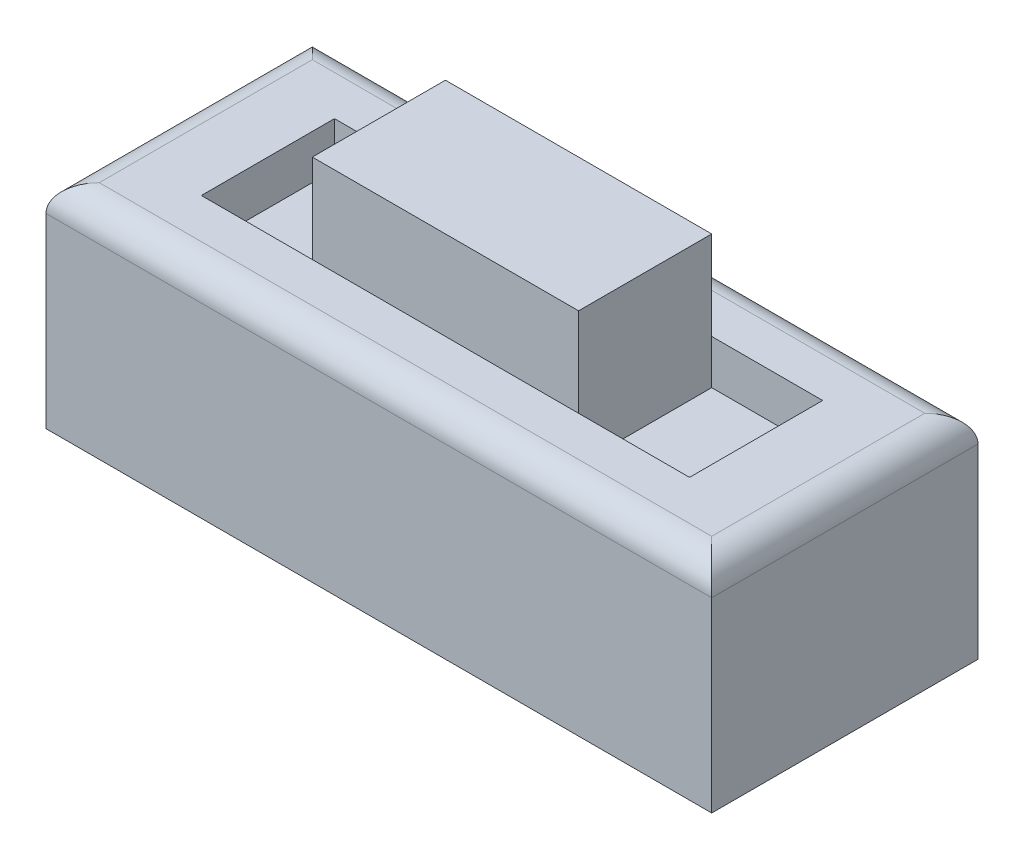
ISO-10303-21;
HEADER;
FILE_DESCRIPTION(('STEP AP214'),'2;1');
FILE_NAME('part.step','',(''),(''),'','','');
FILE_SCHEMA(('AUTOMOTIVE_DESIGN { 1 0 10303 214 1 1 1 1 }'));
ENDSEC;
DATA;
#1=APPLICATION_CONTEXT('core data for automotive mechanical design processes');
#2=APPLICATION_PROTOCOL_DEFINITION('international standard','automotive_design',2000,#1);
#3=PRODUCT_CONTEXT('',#1,'mechanical');
#4=PRODUCT('Part','Part','',(#3));
#5=PRODUCT_RELATED_PRODUCT_CATEGORY('part','',(#4));
#6=PRODUCT_DEFINITION_FORMATION('','',#4);
#7=PRODUCT_DEFINITION_CONTEXT('part definition',#1,'design');
#8=PRODUCT_DEFINITION('design','',#6,#7);
#9=PRODUCT_DEFINITION_SHAPE('','',#8);
#10=(LENGTH_UNIT() NAMED_UNIT(*) SI_UNIT(.MILLI.,.METRE.));
#11=(NAMED_UNIT(*) PLANE_ANGLE_UNIT() SI_UNIT($,.RADIAN.));
#12=(NAMED_UNIT(*) SI_UNIT($,.STERADIAN.) SOLID_ANGLE_UNIT());
#13=UNCERTAINTY_MEASURE_WITH_UNIT(LENGTH_MEASURE(1.E-05),#10,'distance_accuracy_value','');
#14=(GEOMETRIC_REPRESENTATION_CONTEXT(3) GLOBAL_UNCERTAINTY_ASSIGNED_CONTEXT((#13)) GLOBAL_UNIT_ASSIGNED_CONTEXT((#10,
#11,#12)) REPRESENTATION_CONTEXT('',''));
#15=CARTESIAN_POINT('',(0.,0.,0.));
#16=DIRECTION('',(0.,0.,1.));
#17=DIRECTION('',(1.,0.,0.));
#18=AXIS2_PLACEMENT_3D('',#15,#16,#17);
#19=CARTESIAN_POINT('',(-4.18968524629806,2.4,-2.6663961038961));
#20=DIRECTION('',(1.,0.,0.));
#21=DIRECTION('',(0.,0.,-1.));
#22=AXIS2_PLACEMENT_3D('',#19,#20,#21);
#23=PLANE('',#22);
#24=DIRECTION('',(0.,-1.,0.));
#25=VECTOR('',#24,1.);
#26=CARTESIAN_POINT('',(-4.18968524629806,2.4,0.333603896103896));
#27=LINE('',#26,#25);
#28=CARTESIAN_POINT('',(-4.18968524629806,2.1,0.333603896103896));
#29=VERTEX_POINT('',#28);
#30=CARTESIAN_POINT('',(-4.18968524629806,0.,0.333603896103896));
#31=VERTEX_POINT('',#30);
#32=EDGE_CURVE('E514',#29,#31,#27,.T.);
#33=ORIENTED_EDGE('',*,*,#32,.F.);
#34=DIRECTION('',(0.,0.,1.));
#35=VECTOR('',#34,1.);
#36=CARTESIAN_POINT('',(-4.18968524629806,2.1,-2.6663961038961));
#37=LINE('',#36,#35);
#38=CARTESIAN_POINT('',(-4.18968524629806,2.1,-2.6663961038961));
#39=VERTEX_POINT('',#38);
#40=EDGE_CURVE('E530',#29,#39,#37,.F.);
#41=ORIENTED_EDGE('',*,*,#40,.T.);
#42=DIRECTION('',(0.,-1.,0.));
#43=VECTOR('',#42,1.);
#44=CARTESIAN_POINT('',(-4.18968524629806,2.4,-2.6663961038961));
#45=LINE('',#44,#43);
#46=CARTESIAN_POINT('',(-4.18968524629806,0.,-2.6663961038961));
#47=VERTEX_POINT('',#46);
#48=EDGE_CURVE('E505',#39,#47,#45,.T.);
#49=ORIENTED_EDGE('',*,*,#48,.T.);
#50=DIRECTION('',(0.,0.,1.));
#51=VECTOR('',#50,1.);
#52=CARTESIAN_POINT('',(-4.18968524629806,0.,-2.6663961038961));
#53=LINE('',#52,#51);
#54=EDGE_CURVE('E489',#47,#31,#53,.T.);
#55=ORIENTED_EDGE('',*,*,#54,.T.);
#56=EDGE_LOOP('',(#33,#41,#49,#55));
#57=FACE_BOUND('',#56,.T.);
#58=ADVANCED_FACE('F43',(#57),#23,.F.);
#59=CARTESIAN_POINT('',(-4.18968524629806,2.4,0.333603896103896));
#60=DIRECTION('',(0.,0.,-1.));
#61=DIRECTION('',(-1.,0.,0.));
#62=AXIS2_PLACEMENT_3D('',#59,#60,#61);
#63=PLANE('',#62);
#64=DIRECTION('',(0.,-1.,0.));
#65=VECTOR('',#64,1.);
#66=CARTESIAN_POINT('',(3.31031475370194,2.4,0.333603896103896));
#67=LINE('',#66,#65);
#68=CARTESIAN_POINT('',(3.31031475370194,2.1,0.333603896103896));
#69=VERTEX_POINT('',#68);
#70=CARTESIAN_POINT('',(3.31031475370194,0.,0.333603896103896));
#71=VERTEX_POINT('',#70);
#72=EDGE_CURVE('E511',#69,#71,#67,.T.);
#73=ORIENTED_EDGE('',*,*,#72,.F.);
#74=DIRECTION('',(1.,0.,0.));
#75=VECTOR('',#74,1.);
#76=CARTESIAN_POINT('',(-4.18968524629806,2.1,0.333603896103896));
#77=LINE('',#76,#75);
#78=EDGE_CURVE('E11',#69,#29,#77,.F.);
#79=ORIENTED_EDGE('',*,*,#78,.T.);
#80=ORIENTED_EDGE('',*,*,#32,.T.);
#81=DIRECTION('',(1.,0.,0.));
#82=VECTOR('',#81,1.);
#83=CARTESIAN_POINT('',(-4.18968524629806,0.,0.333603896103896));
#84=LINE('',#83,#82);
#85=EDGE_CURVE('E493',#31,#71,#84,.T.);
#86=ORIENTED_EDGE('',*,*,#85,.T.);
#87=EDGE_LOOP('',(#73,#79,#80,#86));
#88=FACE_BOUND('',#87,.T.);
#89=ADVANCED_FACE('F563',(#88),#63,.F.);
#90=CARTESIAN_POINT('',(3.31031475370194,2.4,-2.6663961038961));
#91=DIRECTION('',(-1.,0.,0.));
#92=DIRECTION('',(0.,0.,1.));
#93=AXIS2_PLACEMENT_3D('',#90,#91,#92);
#94=PLANE('',#93);
#95=DIRECTION('',(0.,-1.,0.));
#96=VECTOR('',#95,1.);
#97=CARTESIAN_POINT('',(3.31031475370194,2.4,-2.6663961038961));
#98=LINE('',#97,#96);
#99=CARTESIAN_POINT('',(3.31031475370194,2.1,-2.6663961038961));
#100=VERTEX_POINT('',#99);
#101=CARTESIAN_POINT('',(3.31031475370194,0.,-2.6663961038961));
#102=VERTEX_POINT('',#101);
#103=EDGE_CURVE('E508',#100,#102,#98,.T.);
#104=ORIENTED_EDGE('',*,*,#103,.F.);
#105=DIRECTION('',(0.,0.,-1.));
#106=VECTOR('',#105,1.);
#107=CARTESIAN_POINT('',(3.31031475370194,2.1,0.333603896103896));
#108=LINE('',#107,#106);
#109=EDGE_CURVE('E53',#100,#69,#108,.F.);
#110=ORIENTED_EDGE('',*,*,#109,.T.);
#111=ORIENTED_EDGE('',*,*,#72,.T.);
#112=DIRECTION('',(0.,0.,-1.));
#113=VECTOR('',#112,1.);
#114=CARTESIAN_POINT('',(3.31031475370194,0.,-2.6663961038961));
#115=LINE('',#114,#113);
#116=EDGE_CURVE('E497',#71,#102,#115,.T.);
#117=ORIENTED_EDGE('',*,*,#116,.T.);
#118=EDGE_LOOP('',(#104,#110,#111,#117));
#119=FACE_BOUND('',#118,.T.);
#120=ADVANCED_FACE('F633',(#119),#94,.F.);
#121=CARTESIAN_POINT('',(-4.18968524629806,2.4,-2.6663961038961));
#122=DIRECTION('',(0.,0.,1.));
#123=DIRECTION('',(1.,0.,0.));
#124=AXIS2_PLACEMENT_3D('',#121,#122,#123);
#125=PLANE('',#124);
#126=ORIENTED_EDGE('',*,*,#48,.F.);
#127=DIRECTION('',(-1.,0.,0.));
#128=VECTOR('',#127,1.);
#129=CARTESIAN_POINT('',(3.31031475370194,2.1,-2.6663961038961));
#130=LINE('',#129,#128);
#131=EDGE_CURVE('E68',#39,#100,#130,.F.);
#132=ORIENTED_EDGE('',*,*,#131,.T.);
#133=ORIENTED_EDGE('',*,*,#103,.T.);
#134=DIRECTION('',(-1.,0.,0.));
#135=VECTOR('',#134,1.);
#136=CARTESIAN_POINT('',(-4.18968524629806,0.,-2.6663961038961));
#137=LINE('',#136,#135);
#138=EDGE_CURVE('E501',#102,#47,#137,.T.);
#139=ORIENTED_EDGE('',*,*,#138,.T.);
#140=EDGE_LOOP('',(#126,#132,#133,#139));
#141=FACE_BOUND('',#140,.T.);
#142=ADVANCED_FACE('F576',(#141),#125,.F.);
#143=CARTESIAN_POINT('',(0.,2.4,0.));
#144=DIRECTION('',(0.,1.,0.));
#145=DIRECTION('',(0.,0.,1.));
#146=AXIS2_PLACEMENT_3D('',#143,#144,#145);
#147=PLANE('',#146);
#148=DIRECTION('',(-1.,0.,0.));
#149=VECTOR('',#148,1.);
#150=CARTESIAN_POINT('',(-4.18968524629806,2.4,-2.3663961038961));
#151=LINE('',#150,#149);
#152=CARTESIAN_POINT('',(3.01031475370194,2.4,-2.3663961038961));
#153=VERTEX_POINT('',#152);
#154=CARTESIAN_POINT('',(-3.88968524629806,2.4,-2.3663961038961));
#155=VERTEX_POINT('',#154);
#156=EDGE_CURVE('E523',#153,#155,#151,.T.);
#157=ORIENTED_EDGE('',*,*,#156,.T.);
#158=DIRECTION('',(0.,0.,1.));
#159=VECTOR('',#158,1.);
#160=CARTESIAN_POINT('',(-3.88968524629806,2.4,0.333603896103897));
#161=LINE('',#160,#159);
#162=CARTESIAN_POINT('',(-3.88968524629806,2.4,0.0336038961038964));
#163=VERTEX_POINT('',#162);
#164=EDGE_CURVE('E526',#155,#163,#161,.T.);
#165=ORIENTED_EDGE('',*,*,#164,.T.);
#166=DIRECTION('',(1.,0.,0.));
#167=VECTOR('',#166,1.);
#168=CARTESIAN_POINT('',(3.31031475370194,2.4,0.0336038961038964));
#169=LINE('',#168,#167);
#170=CARTESIAN_POINT('',(3.01031475370194,2.4,0.0336038961038964));
#171=VERTEX_POINT('',#170);
#172=EDGE_CURVE('E517',#163,#171,#169,.T.);
#173=ORIENTED_EDGE('',*,*,#172,.T.);
#174=DIRECTION('',(0.,0.,-1.));
#175=VECTOR('',#174,1.);
#176=CARTESIAN_POINT('',(3.01031475370194,2.4,-2.6663961038961));
#177=LINE('',#176,#175);
#178=EDGE_CURVE('E520',#171,#153,#177,.T.);
#179=ORIENTED_EDGE('',*,*,#178,.T.);
#180=EDGE_LOOP('',(#157,#165,#173,#179));
#181=FACE_BOUND('',#180,.T.);
#182=DIRECTION('',(1.,0.,0.));
#183=VECTOR('',#182,1.);
#184=CARTESIAN_POINT('',(2.31031475370194,2.4,-0.416396103896104));
#185=LINE('',#184,#183);
#186=CARTESIAN_POINT('',(1.06031475370194,2.4,-0.416396103896104));
#187=VERTEX_POINT('',#186);
#188=CARTESIAN_POINT('',(2.31031475370194,2.4,-0.416396103896104));
#189=VERTEX_POINT('',#188);
#190=EDGE_CURVE('E378',#187,#189,#185,.T.);
#191=ORIENTED_EDGE('',*,*,#190,.F.);
#192=DIRECTION('',(1.,0.,0.));
#193=VECTOR('',#192,1.);
#194=CARTESIAN_POINT('',(-1.93968524629806,2.4,-0.416396103896104));
#195=LINE('',#194,#193);
#196=CARTESIAN_POINT('',(-1.93968524629806,2.4,-0.416396103896104));
#197=VERTEX_POINT('',#196);
#198=EDGE_CURVE('E405',#197,#187,#195,.T.);
#199=ORIENTED_EDGE('',*,*,#198,.F.);
#200=DIRECTION('',(1.,0.,0.));
#201=VECTOR('',#200,1.);
#202=CARTESIAN_POINT('',(-3.18968524629806,2.4,-0.416396103896104));
#203=LINE('',#202,#201);
#204=CARTESIAN_POINT('',(-3.18968524629806,2.4,-0.416396103896104));
#205=VERTEX_POINT('',#204);
#206=EDGE_CURVE('E432',#205,#197,#203,.T.);
#207=ORIENTED_EDGE('',*,*,#206,.F.);
#208=DIRECTION('',(0.,0.,1.));
#209=VECTOR('',#208,1.);
#210=CARTESIAN_POINT('',(-3.18968524629806,2.4,-1.9163961038961));
#211=LINE('',#210,#209);
#212=CARTESIAN_POINT('',(-3.18968524629806,2.4,-1.9163961038961));
#213=VERTEX_POINT('',#212);
#214=EDGE_CURVE('E396',#213,#205,#211,.T.);
#215=ORIENTED_EDGE('',*,*,#214,.F.);
#216=DIRECTION('',(-1.,0.,0.));
#217=VECTOR('',#216,1.);
#218=CARTESIAN_POINT('',(-3.18968524629806,2.4,-1.9163961038961));
#219=LINE('',#218,#217);
#220=CARTESIAN_POINT('',(-1.93968524629806,2.4,-1.9163961038961));
#221=VERTEX_POINT('',#220);
#222=EDGE_CURVE('E428',#221,#213,#219,.T.);
#223=ORIENTED_EDGE('',*,*,#222,.F.);
#224=DIRECTION('',(-1.,0.,0.));
#225=VECTOR('',#224,1.);
#226=CARTESIAN_POINT('',(-1.93968524629806,2.4,-1.9163961038961));
#227=LINE('',#226,#225);
#228=CARTESIAN_POINT('',(1.06031475370194,2.4,-1.9163961038961));
#229=VERTEX_POINT('',#228);
#230=EDGE_CURVE('E458',#229,#221,#227,.T.);
#231=ORIENTED_EDGE('',*,*,#230,.F.);
#232=DIRECTION('',(-1.,0.,0.));
#233=VECTOR('',#232,1.);
#234=CARTESIAN_POINT('',(2.31031475370194,2.4,-1.9163961038961));
#235=LINE('',#234,#233);
#236=CARTESIAN_POINT('',(2.31031475370194,2.4,-1.9163961038961));
#237=VERTEX_POINT('',#236);
#238=EDGE_CURVE('E395',#237,#229,#235,.T.);
#239=ORIENTED_EDGE('',*,*,#238,.F.);
#240=DIRECTION('',(0.,0.,-1.));
#241=VECTOR('',#240,1.);
#242=CARTESIAN_POINT('',(2.31031475370194,2.4,-1.9163961038961));
#243=LINE('',#242,#241);
#244=EDGE_CURVE('E391',#189,#237,#243,.T.);
#245=ORIENTED_EDGE('',*,*,#244,.F.);
#246=EDGE_LOOP('',(#191,#199,#207,#215,#223,#231,#239,#245));
#247=FACE_BOUND('',#246,.T.);
#248=ADVANCED_FACE('F572',(#181,#247),#147,.T.);
#249=CARTESIAN_POINT('',(0.,0.,0.));
#250=DIRECTION('',(0.,1.,0.));
#251=DIRECTION('',(0.,0.,1.));
#252=AXIS2_PLACEMENT_3D('',#249,#250,#251);
#253=PLANE('',#252);
#254=DIRECTION('',(1.,0.,0.));
#255=VECTOR('',#254,1.);
#256=CARTESIAN_POINT('',(1.81031475370194,0.,-1.71187468220836));
#257=LINE('',#256,#255);
#258=CARTESIAN_POINT('',(1.81031475370194,0.,-1.71187468220836));
#259=VERTEX_POINT('',#258);
#260=CARTESIAN_POINT('',(2.31031475370194,0.,-1.71187468220836));
#261=VERTEX_POINT('',#260);
#262=EDGE_CURVE('E270',#259,#261,#257,.T.);
#263=ORIENTED_EDGE('',*,*,#262,.F.);
#264=DIRECTION('',(0.,0.,-1.));
#265=VECTOR('',#264,1.);
#266=CARTESIAN_POINT('',(1.81031475370194,0.,-0.71187468220836));
#267=LINE('',#266,#265);
#268=CARTESIAN_POINT('',(1.81031475370194,0.,-0.71187468220836));
#269=VERTEX_POINT('',#268);
#270=EDGE_CURVE('E237',#269,#259,#267,.T.);
#271=ORIENTED_EDGE('',*,*,#270,.F.);
#272=DIRECTION('',(-1.,0.,0.));
#273=VECTOR('',#272,1.);
#274=CARTESIAN_POINT('',(1.81031475370194,0.,-0.71187468220836));
#275=LINE('',#274,#273);
#276=CARTESIAN_POINT('',(2.31031475370194,0.,-0.71187468220836));
#277=VERTEX_POINT('',#276);
#278=EDGE_CURVE('E257',#277,#269,#275,.T.);
#279=ORIENTED_EDGE('',*,*,#278,.F.);
#280=DIRECTION('',(0.,0.,1.));
#281=VECTOR('',#280,1.);
#282=CARTESIAN_POINT('',(2.31031475370194,0.,-0.71187468220836));
#283=LINE('',#282,#281);
#284=EDGE_CURVE('E261',#261,#277,#283,.T.);
#285=ORIENTED_EDGE('',*,*,#284,.F.);
#286=EDGE_LOOP('',(#263,#271,#279,#285));
#287=FACE_BOUND('',#286,.T.);
#288=DIRECTION('',(0.,0.,-1.));
#289=VECTOR('',#288,1.);
#290=CARTESIAN_POINT('',(-0.68968524629806,0.,-0.711874682208378));
#291=LINE('',#290,#289);
#292=CARTESIAN_POINT('',(-0.68968524629806,0.,-0.711874682208378));
#293=VERTEX_POINT('',#292);
#294=CARTESIAN_POINT('',(-0.689685246298059,0.,-1.71187468220838));
#295=VERTEX_POINT('',#294);
#296=EDGE_CURVE('E310',#293,#295,#291,.T.);
#297=ORIENTED_EDGE('',*,*,#296,.F.);
#298=DIRECTION('',(-1.,0.,0.));
#299=VECTOR('',#298,1.);
#300=CARTESIAN_POINT('',(-0.68968524629806,0.,-0.711874682208378));
#301=LINE('',#300,#299);
#302=CARTESIAN_POINT('',(-0.18968524629806,0.,-0.711874682208378));
#303=VERTEX_POINT('',#302);
#304=EDGE_CURVE('E271',#303,#293,#301,.T.);
#305=ORIENTED_EDGE('',*,*,#304,.F.);
#306=DIRECTION('',(0.,0.,1.));
#307=VECTOR('',#306,1.);
#308=CARTESIAN_POINT('',(-0.18968524629806,0.,-0.711874682208378));
#309=LINE('',#308,#307);
#310=CARTESIAN_POINT('',(-0.18968524629806,0.,-1.71187468220838));
#311=VERTEX_POINT('',#310);
#312=EDGE_CURVE('E301',#311,#303,#309,.T.);
#313=ORIENTED_EDGE('',*,*,#312,.F.);
#314=DIRECTION('',(1.,0.,0.));
#315=VECTOR('',#314,1.);
#316=CARTESIAN_POINT('',(-0.689685246298059,0.,-1.71187468220838));
#317=LINE('',#316,#315);
#318=EDGE_CURVE('E305',#295,#311,#317,.T.);
#319=ORIENTED_EDGE('',*,*,#318,.F.);
#320=EDGE_LOOP('',(#297,#305,#313,#319));
#321=FACE_BOUND('',#320,.T.);
#322=DIRECTION('',(0.,0.,-1.));
#323=VECTOR('',#322,1.);
#324=CARTESIAN_POINT('',(-3.18968524629806,0.,-0.711874682208395));
#325=LINE('',#324,#323);
#326=CARTESIAN_POINT('',(-3.18968524629806,0.,-0.711874682208395));
#327=VERTEX_POINT('',#326);
#328=CARTESIAN_POINT('',(-3.18968524629806,0.,-1.7118746822084));
#329=VERTEX_POINT('',#328);
#330=EDGE_CURVE('E353',#327,#329,#325,.T.);
#331=ORIENTED_EDGE('',*,*,#330,.F.);
#332=DIRECTION('',(-1.,0.,0.));
#333=VECTOR('',#332,1.);
#334=CARTESIAN_POINT('',(-3.18968524629806,0.,-0.711874682208395));
#335=LINE('',#334,#333);
#336=CARTESIAN_POINT('',(-2.68968524629806,0.,-0.711874682208395));
#337=VERTEX_POINT('',#336);
#338=EDGE_CURVE('E300',#337,#327,#335,.T.);
#339=ORIENTED_EDGE('',*,*,#338,.F.);
#340=DIRECTION('',(0.,0.,1.));
#341=VECTOR('',#340,1.);
#342=CARTESIAN_POINT('',(-2.68968524629806,0.,-0.711874682208395));
#343=LINE('',#342,#341);
#344=CARTESIAN_POINT('',(-2.68968524629806,0.,-1.7118746822084));
#345=VERTEX_POINT('',#344);
#346=EDGE_CURVE('E344',#345,#337,#343,.T.);
#347=ORIENTED_EDGE('',*,*,#346,.F.);
#348=DIRECTION('',(1.,0.,0.));
#349=VECTOR('',#348,1.);
#350=CARTESIAN_POINT('',(-3.18968524629806,0.,-1.7118746822084));
#351=LINE('',#350,#349);
#352=EDGE_CURVE('E348',#329,#345,#351,.T.);
#353=ORIENTED_EDGE('',*,*,#352,.F.);
#354=EDGE_LOOP('',(#331,#339,#347,#353));
#355=FACE_BOUND('',#354,.T.);
#356=ORIENTED_EDGE('',*,*,#54,.F.);
#357=ORIENTED_EDGE('',*,*,#138,.F.);
#358=ORIENTED_EDGE('',*,*,#116,.F.);
#359=ORIENTED_EDGE('',*,*,#85,.F.);
#360=EDGE_LOOP('',(#356,#357,#358,#359));
#361=FACE_BOUND('',#360,.T.);
#362=ADVANCED_FACE('F575',(#287,#321,#355,#361),#253,.F.);
#363=CARTESIAN_POINT('',(-1.93968524629806,3.4,-1.9163961038961));
#364=DIRECTION('',(1.,0.,0.));
#365=DIRECTION('',(0.,0.,-1.));
#366=AXIS2_PLACEMENT_3D('',#363,#364,#365);
#367=PLANE('',#366);
#368=DIRECTION('',(0.,-1.,0.));
#369=VECTOR('',#368,1.);
#370=CARTESIAN_POINT('',(-1.93968524629806,3.4,-1.9163961038961));
#371=LINE('',#370,#369);
#372=CARTESIAN_POINT('',(-1.93968524629806,3.4,-1.9163961038961));
#373=VERTEX_POINT('',#372);
#374=EDGE_CURVE('E467',#373,#221,#371,.T.);
#375=ORIENTED_EDGE('',*,*,#374,.T.);
#376=DIRECTION('',(0.,1.,0.));
#377=VECTOR('',#376,1.);
#378=CARTESIAN_POINT('',(-1.93968524629806,1.9,-1.9163961038961));
#379=LINE('',#378,#377);
#380=CARTESIAN_POINT('',(-1.93968524629806,1.9,-1.9163961038961));
#381=VERTEX_POINT('',#380);
#382=EDGE_CURVE('E423',#381,#221,#379,.T.);
#383=ORIENTED_EDGE('',*,*,#382,.F.);
#384=DIRECTION('',(0.,0.,-1.));
#385=VECTOR('',#384,1.);
#386=CARTESIAN_POINT('',(-1.93968524629806,1.9,-1.9163961038961));
#387=LINE('',#386,#385);
#388=CARTESIAN_POINT('',(-1.93968524629806,1.9,-0.416396103896104));
#389=VERTEX_POINT('',#388);
#390=EDGE_CURVE('E442',#389,#381,#387,.T.);
#391=ORIENTED_EDGE('',*,*,#390,.F.);
#392=DIRECTION('',(0.,1.,0.));
#393=VECTOR('',#392,1.);
#394=CARTESIAN_POINT('',(-1.93968524629806,1.9,-0.416396103896104));
#395=LINE('',#394,#393);
#396=EDGE_CURVE('E419',#389,#197,#395,.T.);
#397=ORIENTED_EDGE('',*,*,#396,.T.);
#398=DIRECTION('',(0.,-1.,0.));
#399=VECTOR('',#398,1.);
#400=CARTESIAN_POINT('',(-1.93968524629806,3.4,-0.416396103896104));
#401=LINE('',#400,#399);
#402=CARTESIAN_POINT('',(-1.93968524629806,3.4,-0.416396103896104));
#403=VERTEX_POINT('',#402);
#404=EDGE_CURVE('E485',#403,#197,#401,.T.);
#405=ORIENTED_EDGE('',*,*,#404,.F.);
#406=DIRECTION('',(0.,0.,1.));
#407=VECTOR('',#406,1.);
#408=CARTESIAN_POINT('',(-1.93968524629806,3.4,-1.9163961038961));
#409=LINE('',#408,#407);
#410=EDGE_CURVE('E453',#373,#403,#409,.T.);
#411=ORIENTED_EDGE('',*,*,#410,.F.);
#412=EDGE_LOOP('',(#375,#383,#391,#397,#405,#411));
#413=FACE_BOUND('',#412,.T.);
#414=ADVANCED_FACE('F599',(#413),#367,.F.);
#415=CARTESIAN_POINT('',(-1.93968524629806,3.4,-0.416396103896104));
#416=DIRECTION('',(0.,0.,-1.));
#417=DIRECTION('',(-1.,0.,0.));
#418=AXIS2_PLACEMENT_3D('',#415,#416,#417);
#419=PLANE('',#418);
#420=ORIENTED_EDGE('',*,*,#198,.T.);
#421=DIRECTION('',(0.,-1.,0.));
#422=VECTOR('',#421,1.);
#423=CARTESIAN_POINT('',(1.06031475370194,3.4,-0.416396103896104));
#424=LINE('',#423,#422);
#425=CARTESIAN_POINT('',(1.06031475370194,3.4,-0.416396103896104));
#426=VERTEX_POINT('',#425);
#427=EDGE_CURVE('E481',#426,#187,#424,.T.);
#428=ORIENTED_EDGE('',*,*,#427,.F.);
#429=DIRECTION('',(1.,0.,0.));
#430=VECTOR('',#429,1.);
#431=CARTESIAN_POINT('',(-1.93968524629806,3.4,-0.416396103896104));
#432=LINE('',#431,#430);
#433=EDGE_CURVE('E457',#403,#426,#432,.T.);
#434=ORIENTED_EDGE('',*,*,#433,.F.);
#435=ORIENTED_EDGE('',*,*,#404,.T.);
#436=EDGE_LOOP('',(#420,#428,#434,#435));
#437=FACE_BOUND('',#436,.T.);
#438=ADVANCED_FACE('F586',(#437),#419,.F.);
#439=CARTESIAN_POINT('',(1.06031475370194,3.4,-1.9163961038961));
#440=DIRECTION('',(-1.,0.,0.));
#441=DIRECTION('',(0.,0.,1.));
#442=AXIS2_PLACEMENT_3D('',#439,#440,#441);
#443=PLANE('',#442);
#444=ORIENTED_EDGE('',*,*,#427,.T.);
#445=DIRECTION('',(0.,1.,0.));
#446=VECTOR('',#445,1.);
#447=CARTESIAN_POINT('',(1.06031475370194,1.9,-0.416396103896104));
#448=LINE('',#447,#446);
#449=CARTESIAN_POINT('',(1.06031475370194,1.9,-0.416396103896104));
#450=VERTEX_POINT('',#449);
#451=EDGE_CURVE('E406',#450,#187,#448,.T.);
#452=ORIENTED_EDGE('',*,*,#451,.F.);
#453=DIRECTION('',(0.,0.,1.));
#454=VECTOR('',#453,1.);
#455=CARTESIAN_POINT('',(1.06031475370194,1.9,-1.9163961038961));
#456=LINE('',#455,#454);
#457=CARTESIAN_POINT('',(1.06031475370194,1.9,-1.9163961038961));
#458=VERTEX_POINT('',#457);
#459=EDGE_CURVE('E382',#458,#450,#456,.T.);
#460=ORIENTED_EDGE('',*,*,#459,.F.);
#461=DIRECTION('',(0.,1.,0.));
#462=VECTOR('',#461,1.);
#463=CARTESIAN_POINT('',(1.06031475370194,1.9,-1.9163961038961));
#464=LINE('',#463,#462);
#465=EDGE_CURVE('E409',#458,#229,#464,.T.);
#466=ORIENTED_EDGE('',*,*,#465,.T.);
#467=DIRECTION('',(0.,-1.,0.));
#468=VECTOR('',#467,1.);
#469=CARTESIAN_POINT('',(1.06031475370194,3.4,-1.9163961038961));
#470=LINE('',#469,#468);
#471=CARTESIAN_POINT('',(1.06031475370194,3.4,-1.9163961038961));
#472=VERTEX_POINT('',#471);
#473=EDGE_CURVE('E477',#472,#229,#470,.T.);
#474=ORIENTED_EDGE('',*,*,#473,.F.);
#475=DIRECTION('',(0.,0.,-1.));
#476=VECTOR('',#475,1.);
#477=CARTESIAN_POINT('',(1.06031475370194,3.4,-1.9163961038961));
#478=LINE('',#477,#476);
#479=EDGE_CURVE('E461',#426,#472,#478,.T.);
#480=ORIENTED_EDGE('',*,*,#479,.F.);
#481=EDGE_LOOP('',(#444,#452,#460,#466,#474,#480));
#482=FACE_BOUND('',#481,.T.);
#483=ADVANCED_FACE('F590',(#482),#443,.F.);
#484=CARTESIAN_POINT('',(-1.93968524629806,3.4,-1.9163961038961));
#485=DIRECTION('',(0.,0.,1.));
#486=DIRECTION('',(1.,0.,0.));
#487=AXIS2_PLACEMENT_3D('',#484,#485,#486);
#488=PLANE('',#487);
#489=ORIENTED_EDGE('',*,*,#230,.T.);
#490=ORIENTED_EDGE('',*,*,#374,.F.);
#491=DIRECTION('',(-1.,0.,0.));
#492=VECTOR('',#491,1.);
#493=CARTESIAN_POINT('',(-1.93968524629806,3.4,-1.9163961038961));
#494=LINE('',#493,#492);
#495=EDGE_CURVE('E464',#472,#373,#494,.T.);
#496=ORIENTED_EDGE('',*,*,#495,.F.);
#497=ORIENTED_EDGE('',*,*,#473,.T.);
#498=EDGE_LOOP('',(#489,#490,#496,#497));
#499=FACE_BOUND('',#498,.T.);
#500=ADVANCED_FACE('F968',(#499),#488,.F.);
#501=CARTESIAN_POINT('',(0.,3.4,0.));
#502=DIRECTION('',(0.,1.,0.));
#503=DIRECTION('',(0.,0.,1.));
#504=AXIS2_PLACEMENT_3D('',#501,#502,#503);
#505=PLANE('',#504);
#506=ORIENTED_EDGE('',*,*,#410,.T.);
#507=ORIENTED_EDGE('',*,*,#433,.T.);
#508=ORIENTED_EDGE('',*,*,#479,.T.);
#509=ORIENTED_EDGE('',*,*,#495,.T.);
#510=EDGE_LOOP('',(#506,#507,#508,#509));
#511=FACE_BOUND('',#510,.T.);
#512=ADVANCED_FACE('F595',(#511),#505,.T.);
#513=CARTESIAN_POINT('',(2.31031475370194,1.9,-1.9163961038961));
#514=DIRECTION('',(1.,0.,0.));
#515=DIRECTION('',(0.,0.,-1.));
#516=AXIS2_PLACEMENT_3D('',#513,#514,#515);
#517=PLANE('',#516);
#518=ORIENTED_EDGE('',*,*,#244,.T.);
#519=DIRECTION('',(0.,1.,0.));
#520=VECTOR('',#519,1.);
#521=CARTESIAN_POINT('',(2.31031475370194,1.9,-1.9163961038961));
#522=LINE('',#521,#520);
#523=CARTESIAN_POINT('',(2.31031475370194,1.9,-1.9163961038961));
#524=VERTEX_POINT('',#523);
#525=EDGE_CURVE('E390',#524,#237,#522,.T.);
#526=ORIENTED_EDGE('',*,*,#525,.F.);
#527=DIRECTION('',(0.,0.,-1.));
#528=VECTOR('',#527,1.);
#529=CARTESIAN_POINT('',(2.31031475370194,1.9,-1.9163961038961));
#530=LINE('',#529,#528);
#531=CARTESIAN_POINT('',(2.31031475370194,1.9,-0.416396103896104));
#532=VERTEX_POINT('',#531);
#533=EDGE_CURVE('E373',#532,#524,#530,.T.);
#534=ORIENTED_EDGE('',*,*,#533,.F.);
#535=DIRECTION('',(0.,1.,0.));
#536=VECTOR('',#535,1.);
#537=CARTESIAN_POINT('',(2.31031475370194,1.9,-0.416396103896104));
#538=LINE('',#537,#536);
#539=EDGE_CURVE('E402',#532,#189,#538,.T.);
#540=ORIENTED_EDGE('',*,*,#539,.T.);
#541=EDGE_LOOP('',(#518,#526,#534,#540));
#542=FACE_BOUND('',#541,.T.);
#543=ADVANCED_FACE('F706',(#542),#517,.F.);
#544=CARTESIAN_POINT('',(2.31031475370194,1.9,-0.416396103896104));
#545=DIRECTION('',(0.,0.,1.));
#546=DIRECTION('',(1.,0.,0.));
#547=AXIS2_PLACEMENT_3D('',#544,#545,#546);
#548=PLANE('',#547);
#549=ORIENTED_EDGE('',*,*,#190,.T.);
#550=ORIENTED_EDGE('',*,*,#539,.F.);
#551=DIRECTION('',(1.,0.,0.));
#552=VECTOR('',#551,1.);
#553=CARTESIAN_POINT('',(2.31031475370194,1.9,-0.416396103896104));
#554=LINE('',#553,#552);
#555=EDGE_CURVE('E386',#450,#532,#554,.T.);
#556=ORIENTED_EDGE('',*,*,#555,.F.);
#557=ORIENTED_EDGE('',*,*,#451,.T.);
#558=EDGE_LOOP('',(#549,#550,#556,#557));
#559=FACE_BOUND('',#558,.T.);
#560=ADVANCED_FACE('F703',(#559),#548,.F.);
#561=CARTESIAN_POINT('',(2.31031475370194,1.9,-1.9163961038961));
#562=DIRECTION('',(0.,0.,-1.));
#563=DIRECTION('',(-1.,0.,0.));
#564=AXIS2_PLACEMENT_3D('',#561,#562,#563);
#565=PLANE('',#564);
#566=ORIENTED_EDGE('',*,*,#238,.T.);
#567=ORIENTED_EDGE('',*,*,#465,.F.);
#568=DIRECTION('',(-1.,0.,0.));
#569=VECTOR('',#568,1.);
#570=CARTESIAN_POINT('',(2.31031475370194,1.9,-1.9163961038961));
#571=LINE('',#570,#569);
#572=EDGE_CURVE('E377',#524,#458,#571,.T.);
#573=ORIENTED_EDGE('',*,*,#572,.F.);
#574=ORIENTED_EDGE('',*,*,#525,.T.);
#575=EDGE_LOOP('',(#566,#567,#573,#574));
#576=FACE_BOUND('',#575,.T.);
#577=ADVANCED_FACE('F701',(#576),#565,.F.);
#578=CARTESIAN_POINT('',(0.,1.9,0.));
#579=DIRECTION('',(0.,-1.,0.));
#580=DIRECTION('',(0.,0.,-1.));
#581=AXIS2_PLACEMENT_3D('',#578,#579,#580);
#582=PLANE('',#581);
#583=ORIENTED_EDGE('',*,*,#533,.T.);
#584=ORIENTED_EDGE('',*,*,#572,.T.);
#585=ORIENTED_EDGE('',*,*,#459,.T.);
#586=ORIENTED_EDGE('',*,*,#555,.T.);
#587=EDGE_LOOP('',(#583,#584,#585,#586));
#588=FACE_BOUND('',#587,.T.);
#589=ADVANCED_FACE('F698',(#588),#582,.F.);
#590=CARTESIAN_POINT('',(-3.18968524629806,1.9,-1.9163961038961));
#591=DIRECTION('',(-1.,0.,0.));
#592=DIRECTION('',(0.,0.,1.));
#593=AXIS2_PLACEMENT_3D('',#590,#591,#592);
#594=PLANE('',#593);
#595=ORIENTED_EDGE('',*,*,#214,.T.);
#596=DIRECTION('',(0.,1.,0.));
#597=VECTOR('',#596,1.);
#598=CARTESIAN_POINT('',(-3.18968524629806,1.9,-0.416396103896104));
#599=LINE('',#598,#597);
#600=CARTESIAN_POINT('',(-3.18968524629806,1.9,-0.416396103896104));
#601=VERTEX_POINT('',#600);
#602=EDGE_CURVE('E415',#601,#205,#599,.T.);
#603=ORIENTED_EDGE('',*,*,#602,.F.);
#604=DIRECTION('',(0.,0.,1.));
#605=VECTOR('',#604,1.);
#606=CARTESIAN_POINT('',(-3.18968524629806,1.9,-1.9163961038961));
#607=LINE('',#606,#605);
#608=CARTESIAN_POINT('',(-3.18968524629806,1.9,-1.9163961038961));
#609=VERTEX_POINT('',#608);
#610=EDGE_CURVE('E433',#609,#601,#607,.T.);
#611=ORIENTED_EDGE('',*,*,#610,.F.);
#612=DIRECTION('',(0.,1.,0.));
#613=VECTOR('',#612,1.);
#614=CARTESIAN_POINT('',(-3.18968524629806,1.9,-1.9163961038961));
#615=LINE('',#614,#613);
#616=EDGE_CURVE('E280',#609,#213,#615,.T.);
#617=ORIENTED_EDGE('',*,*,#616,.T.);
#618=EDGE_LOOP('',(#595,#603,#611,#617));
#619=FACE_BOUND('',#618,.T.);
#620=ADVANCED_FACE('F608',(#619),#594,.F.);
#621=CARTESIAN_POINT('',(-3.18968524629806,1.9,-1.9163961038961));
#622=DIRECTION('',(0.,0.,-1.));
#623=DIRECTION('',(-1.,0.,0.));
#624=AXIS2_PLACEMENT_3D('',#621,#622,#623);
#625=PLANE('',#624);
#626=ORIENTED_EDGE('',*,*,#222,.T.);
#627=ORIENTED_EDGE('',*,*,#616,.F.);
#628=DIRECTION('',(-1.,0.,0.));
#629=VECTOR('',#628,1.);
#630=CARTESIAN_POINT('',(-3.18968524629806,1.9,-1.9163961038961));
#631=LINE('',#630,#629);
#632=EDGE_CURVE('E418',#381,#609,#631,.T.);
#633=ORIENTED_EDGE('',*,*,#632,.F.);
#634=ORIENTED_EDGE('',*,*,#382,.T.);
#635=EDGE_LOOP('',(#626,#627,#633,#634));
#636=FACE_BOUND('',#635,.T.);
#637=ADVANCED_FACE('F612',(#636),#625,.F.);
#638=CARTESIAN_POINT('',(-3.18968524629806,1.9,-0.416396103896104));
#639=DIRECTION('',(0.,0.,1.));
#640=DIRECTION('',(1.,0.,0.));
#641=AXIS2_PLACEMENT_3D('',#638,#639,#640);
#642=PLANE('',#641);
#643=ORIENTED_EDGE('',*,*,#206,.T.);
#644=ORIENTED_EDGE('',*,*,#396,.F.);
#645=DIRECTION('',(1.,0.,0.));
#646=VECTOR('',#645,1.);
#647=CARTESIAN_POINT('',(-3.18968524629806,1.9,-0.416396103896104));
#648=LINE('',#647,#646);
#649=EDGE_CURVE('E446',#601,#389,#648,.T.);
#650=ORIENTED_EDGE('',*,*,#649,.F.);
#651=ORIENTED_EDGE('',*,*,#602,.T.);
#652=EDGE_LOOP('',(#643,#644,#650,#651));
#653=FACE_BOUND('',#652,.T.);
#654=ADVANCED_FACE('F603',(#653),#642,.F.);
#655=CARTESIAN_POINT('',(0.,1.9,0.));
#656=DIRECTION('',(0.,1.,0.));
#657=DIRECTION('',(0.,0.,1.));
#658=AXIS2_PLACEMENT_3D('',#655,#656,#657);
#659=PLANE('',#658);
#660=ORIENTED_EDGE('',*,*,#610,.T.);
#661=ORIENTED_EDGE('',*,*,#649,.T.);
#662=ORIENTED_EDGE('',*,*,#390,.T.);
#663=ORIENTED_EDGE('',*,*,#632,.T.);
#664=EDGE_LOOP('',(#660,#661,#662,#663));
#665=FACE_BOUND('',#664,.T.);
#666=ADVANCED_FACE('F614',(#665),#659,.T.);
#667=CARTESIAN_POINT('',(-3.18968524629806,1.,-0.711874682208395));
#668=DIRECTION('',(0.,0.,1.));
#669=DIRECTION('',(1.,0.,0.));
#670=AXIS2_PLACEMENT_3D('',#667,#668,#669);
#671=PLANE('',#670);
#672=ORIENTED_EDGE('',*,*,#338,.T.);
#673=DIRECTION('',(0.,-1.,0.));
#674=VECTOR('',#673,1.);
#675=CARTESIAN_POINT('',(-3.18968524629806,1.,-0.711874682208395));
#676=LINE('',#675,#674);
#677=CARTESIAN_POINT('',(-3.18968524629806,1.,-0.711874682208395));
#678=VERTEX_POINT('',#677);
#679=EDGE_CURVE('E330',#678,#327,#676,.T.);
#680=ORIENTED_EDGE('',*,*,#679,.F.);
#681=DIRECTION('',(-1.,0.,0.));
#682=VECTOR('',#681,1.);
#683=CARTESIAN_POINT('',(-3.18968524629806,1.,-0.711874682208395));
#684=LINE('',#683,#682);
#685=CARTESIAN_POINT('',(-2.68968524629806,1.,-0.711874682208395));
#686=VERTEX_POINT('',#685);
#687=EDGE_CURVE('E349',#686,#678,#684,.T.);
#688=ORIENTED_EDGE('',*,*,#687,.F.);
#689=DIRECTION('',(0.,-1.,0.));
#690=VECTOR('',#689,1.);
#691=CARTESIAN_POINT('',(-2.68968524629806,1.,-0.711874682208395));
#692=LINE('',#691,#690);
#693=EDGE_CURVE('E341',#686,#337,#692,.T.);
#694=ORIENTED_EDGE('',*,*,#693,.T.);
#695=EDGE_LOOP('',(#672,#680,#688,#694));
#696=FACE_BOUND('',#695,.T.);
#697=ADVANCED_FACE('F616',(#696),#671,.F.);
#698=CARTESIAN_POINT('',(-2.68968524629806,1.,-0.711874682208395));
#699=DIRECTION('',(1.,0.,0.));
#700=DIRECTION('',(0.,0.,-1.));
#701=AXIS2_PLACEMENT_3D('',#698,#699,#700);
#702=PLANE('',#701);
#703=ORIENTED_EDGE('',*,*,#346,.T.);
#704=ORIENTED_EDGE('',*,*,#693,.F.);
#705=DIRECTION('',(0.,0.,1.));
#706=VECTOR('',#705,1.);
#707=CARTESIAN_POINT('',(-2.68968524629806,1.,-0.711874682208395));
#708=LINE('',#707,#706);
#709=CARTESIAN_POINT('',(-2.68968524629806,1.,-1.7118746822084));
#710=VERTEX_POINT('',#709);
#711=EDGE_CURVE('E334',#710,#686,#708,.T.);
#712=ORIENTED_EDGE('',*,*,#711,.F.);
#713=DIRECTION('',(0.,-1.,0.));
#714=VECTOR('',#713,1.);
#715=CARTESIAN_POINT('',(-2.68968524629806,1.,-1.7118746822084));
#716=LINE('',#715,#714);
#717=EDGE_CURVE('E338',#710,#345,#716,.T.);
#718=ORIENTED_EDGE('',*,*,#717,.T.);
#719=EDGE_LOOP('',(#703,#704,#712,#718));
#720=FACE_BOUND('',#719,.T.);
#721=ADVANCED_FACE('F622',(#720),#702,.F.);
#722=CARTESIAN_POINT('',(-3.18968524629806,1.,-1.7118746822084));
#723=DIRECTION('',(0.,0.,-1.));
#724=DIRECTION('',(-1.,0.,0.));
#725=AXIS2_PLACEMENT_3D('',#722,#723,#724);
#726=PLANE('',#725);
#727=ORIENTED_EDGE('',*,*,#352,.T.);
#728=ORIENTED_EDGE('',*,*,#717,.F.);
#729=DIRECTION('',(1.,0.,0.));
#730=VECTOR('',#729,1.);
#731=CARTESIAN_POINT('',(-3.18968524629806,1.,-1.7118746822084));
#732=LINE('',#731,#730);
#733=CARTESIAN_POINT('',(-3.18968524629806,1.,-1.7118746822084));
#734=VERTEX_POINT('',#733);
#735=EDGE_CURVE('E362',#734,#710,#732,.T.);
#736=ORIENTED_EDGE('',*,*,#735,.F.);
#737=DIRECTION('',(0.,-1.,0.));
#738=VECTOR('',#737,1.);
#739=CARTESIAN_POINT('',(-3.18968524629806,1.,-1.7118746822084));
#740=LINE('',#739,#738);
#741=EDGE_CURVE('E335',#734,#329,#740,.T.);
#742=ORIENTED_EDGE('',*,*,#741,.T.);
#743=EDGE_LOOP('',(#727,#728,#736,#742));
#744=FACE_BOUND('',#743,.T.);
#745=ADVANCED_FACE('F687',(#744),#726,.F.);
#746=CARTESIAN_POINT('',(-3.18968524629806,1.,-0.711874682208395));
#747=DIRECTION('',(-1.,0.,0.));
#748=DIRECTION('',(0.,0.,1.));
#749=AXIS2_PLACEMENT_3D('',#746,#747,#748);
#750=PLANE('',#749);
#751=ORIENTED_EDGE('',*,*,#330,.T.);
#752=ORIENTED_EDGE('',*,*,#741,.F.);
#753=DIRECTION('',(0.,0.,-1.));
#754=VECTOR('',#753,1.);
#755=CARTESIAN_POINT('',(-3.18968524629806,1.,-0.711874682208395));
#756=LINE('',#755,#754);
#757=EDGE_CURVE('E366',#678,#734,#756,.T.);
#758=ORIENTED_EDGE('',*,*,#757,.F.);
#759=ORIENTED_EDGE('',*,*,#679,.T.);
#760=EDGE_LOOP('',(#751,#752,#758,#759));
#761=FACE_BOUND('',#760,.T.);
#762=ADVANCED_FACE('F684',(#761),#750,.F.);
#763=CARTESIAN_POINT('',(0.,1.,0.));
#764=DIRECTION('',(0.,1.,0.));
#765=DIRECTION('',(0.,0.,1.));
#766=AXIS2_PLACEMENT_3D('',#763,#764,#765);
#767=PLANE('',#766);
#768=ORIENTED_EDGE('',*,*,#687,.T.);
#769=ORIENTED_EDGE('',*,*,#757,.T.);
#770=ORIENTED_EDGE('',*,*,#735,.T.);
#771=ORIENTED_EDGE('',*,*,#711,.T.);
#772=EDGE_LOOP('',(#768,#769,#770,#771));
#773=FACE_BOUND('',#772,.T.);
#774=ADVANCED_FACE('F668',(#773),#767,.F.);
#775=CARTESIAN_POINT('',(-0.68968524629806,1.,-0.711874682208378));
#776=DIRECTION('',(0.,0.,1.));
#777=DIRECTION('',(1.,0.,0.));
#778=AXIS2_PLACEMENT_3D('',#775,#776,#777);
#779=PLANE('',#778);
#780=ORIENTED_EDGE('',*,*,#304,.T.);
#781=DIRECTION('',(0.,-1.,0.));
#782=VECTOR('',#781,1.);
#783=CARTESIAN_POINT('',(-0.68968524629806,1.,-0.711874682208378));
#784=LINE('',#783,#782);
#785=CARTESIAN_POINT('',(-0.68968524629806,1.,-0.711874682208378));
#786=VERTEX_POINT('',#785);
#787=EDGE_CURVE('E286',#786,#293,#784,.T.);
#788=ORIENTED_EDGE('',*,*,#787,.F.);
#789=DIRECTION('',(-1.,0.,0.));
#790=VECTOR('',#789,1.);
#791=CARTESIAN_POINT('',(-0.68968524629806,1.,-0.711874682208378));
#792=LINE('',#791,#790);
#793=CARTESIAN_POINT('',(-0.18968524629806,1.,-0.711874682208378));
#794=VERTEX_POINT('',#793);
#795=EDGE_CURVE('E306',#794,#786,#792,.T.);
#796=ORIENTED_EDGE('',*,*,#795,.F.);
#797=DIRECTION('',(0.,-1.,0.));
#798=VECTOR('',#797,1.);
#799=CARTESIAN_POINT('',(-0.18968524629806,1.,-0.711874682208378));
#800=LINE('',#799,#798);
#801=EDGE_CURVE('E297',#794,#303,#800,.T.);
#802=ORIENTED_EDGE('',*,*,#801,.T.);
#803=EDGE_LOOP('',(#780,#788,#796,#802));
#804=FACE_BOUND('',#803,.T.);
#805=ADVANCED_FACE('F664',(#804),#779,.F.);
#806=CARTESIAN_POINT('',(-0.18968524629806,1.,-0.711874682208378));
#807=DIRECTION('',(1.,0.,0.));
#808=DIRECTION('',(0.,0.,-1.));
#809=AXIS2_PLACEMENT_3D('',#806,#807,#808);
#810=PLANE('',#809);
#811=ORIENTED_EDGE('',*,*,#312,.T.);
#812=ORIENTED_EDGE('',*,*,#801,.F.);
#813=DIRECTION('',(0.,0.,1.));
#814=VECTOR('',#813,1.);
#815=CARTESIAN_POINT('',(-0.18968524629806,1.,-0.711874682208378));
#816=LINE('',#815,#814);
#817=CARTESIAN_POINT('',(-0.18968524629806,1.,-1.71187468220838));
#818=VERTEX_POINT('',#817);
#819=EDGE_CURVE('E290',#818,#794,#816,.T.);
#820=ORIENTED_EDGE('',*,*,#819,.F.);
#821=DIRECTION('',(0.,-1.,0.));
#822=VECTOR('',#821,1.);
#823=CARTESIAN_POINT('',(-0.18968524629806,1.,-1.71187468220838));
#824=LINE('',#823,#822);
#825=EDGE_CURVE('E294',#818,#311,#824,.T.);
#826=ORIENTED_EDGE('',*,*,#825,.T.);
#827=EDGE_LOOP('',(#811,#812,#820,#826));
#828=FACE_BOUND('',#827,.T.);
#829=ADVANCED_FACE('F667',(#828),#810,.F.);
#830=CARTESIAN_POINT('',(-0.689685246298059,1.,-1.71187468220838));
#831=DIRECTION('',(0.,0.,-1.));
#832=DIRECTION('',(-1.,0.,0.));
#833=AXIS2_PLACEMENT_3D('',#830,#831,#832);
#834=PLANE('',#833);
#835=ORIENTED_EDGE('',*,*,#318,.T.);
#836=ORIENTED_EDGE('',*,*,#825,.F.);
#837=DIRECTION('',(1.,0.,0.));
#838=VECTOR('',#837,1.);
#839=CARTESIAN_POINT('',(-0.689685246298059,1.,-1.71187468220838));
#840=LINE('',#839,#838);
#841=CARTESIAN_POINT('',(-0.689685246298059,1.,-1.71187468220838));
#842=VERTEX_POINT('',#841);
#843=EDGE_CURVE('E319',#842,#818,#840,.T.);
#844=ORIENTED_EDGE('',*,*,#843,.F.);
#845=DIRECTION('',(0.,-1.,0.));
#846=VECTOR('',#845,1.);
#847=CARTESIAN_POINT('',(-0.689685246298059,1.,-1.71187468220838));
#848=LINE('',#847,#846);
#849=EDGE_CURVE('E291',#842,#295,#848,.T.);
#850=ORIENTED_EDGE('',*,*,#849,.T.);
#851=EDGE_LOOP('',(#835,#836,#844,#850));
#852=FACE_BOUND('',#851,.T.);
#853=ADVANCED_FACE('F673',(#852),#834,.F.);
#854=CARTESIAN_POINT('',(-0.68968524629806,1.,-0.711874682208378));
#855=DIRECTION('',(-1.,0.,0.));
#856=DIRECTION('',(0.,0.,1.));
#857=AXIS2_PLACEMENT_3D('',#854,#855,#856);
#858=PLANE('',#857);
#859=ORIENTED_EDGE('',*,*,#296,.T.);
#860=ORIENTED_EDGE('',*,*,#849,.F.);
#861=DIRECTION('',(0.,0.,-1.));
#862=VECTOR('',#861,1.);
#863=CARTESIAN_POINT('',(-0.68968524629806,1.,-0.711874682208378));
#864=LINE('',#863,#862);
#865=EDGE_CURVE('E323',#786,#842,#864,.T.);
#866=ORIENTED_EDGE('',*,*,#865,.F.);
#867=ORIENTED_EDGE('',*,*,#787,.T.);
#868=EDGE_LOOP('',(#859,#860,#866,#867));
#869=FACE_BOUND('',#868,.T.);
#870=ADVANCED_FACE('F670',(#869),#858,.F.);
#871=CARTESIAN_POINT('',(0.,1.,0.));
#872=DIRECTION('',(0.,1.,0.));
#873=DIRECTION('',(0.,0.,1.));
#874=AXIS2_PLACEMENT_3D('',#871,#872,#873);
#875=PLANE('',#874);
#876=ORIENTED_EDGE('',*,*,#795,.T.);
#877=ORIENTED_EDGE('',*,*,#865,.T.);
#878=ORIENTED_EDGE('',*,*,#843,.T.);
#879=ORIENTED_EDGE('',*,*,#819,.T.);
#880=EDGE_LOOP('',(#876,#877,#878,#879));
#881=FACE_BOUND('',#880,.T.);
#882=ADVANCED_FACE('F663',(#881),#875,.F.);
#883=CARTESIAN_POINT('',(1.81031475370194,1.,-0.71187468220836));
#884=DIRECTION('',(-1.,0.,0.));
#885=DIRECTION('',(0.,0.,1.));
#886=AXIS2_PLACEMENT_3D('',#883,#884,#885);
#887=PLANE('',#886);
#888=ORIENTED_EDGE('',*,*,#270,.T.);
#889=DIRECTION('',(0.,-1.,0.));
#890=VECTOR('',#889,1.);
#891=CARTESIAN_POINT('',(1.81031475370194,1.,-1.71187468220836));
#892=LINE('',#891,#890);
#893=CARTESIAN_POINT('',(1.81031475370194,1.,-1.71187468220836));
#894=VERTEX_POINT('',#893);
#895=EDGE_CURVE('E230',#894,#259,#892,.T.);
#896=ORIENTED_EDGE('',*,*,#895,.F.);
#897=DIRECTION('',(0.,0.,-1.));
#898=VECTOR('',#897,1.);
#899=CARTESIAN_POINT('',(1.81031475370194,1.,-0.71187468220836));
#900=LINE('',#899,#898);
#901=CARTESIAN_POINT('',(1.81031475370194,1.,-0.71187468220836));
#902=VERTEX_POINT('',#901);
#903=EDGE_CURVE('E234',#902,#894,#900,.T.);
#904=ORIENTED_EDGE('',*,*,#903,.F.);
#905=DIRECTION('',(0.,-1.,0.));
#906=VECTOR('',#905,1.);
#907=CARTESIAN_POINT('',(1.81031475370194,1.,-0.71187468220836));
#908=LINE('',#907,#906);
#909=EDGE_CURVE('E277',#902,#269,#908,.T.);
#910=ORIENTED_EDGE('',*,*,#909,.T.);
#911=EDGE_LOOP('',(#888,#896,#904,#910));
#912=FACE_BOUND('',#911,.T.);
#913=ADVANCED_FACE('F232',(#912),#887,.F.);
#914=CARTESIAN_POINT('',(1.81031475370194,1.,-0.71187468220836));
#915=DIRECTION('',(0.,0.,1.));
#916=DIRECTION('',(1.,0.,0.));
#917=AXIS2_PLACEMENT_3D('',#914,#915,#916);
#918=PLANE('',#917);
#919=ORIENTED_EDGE('',*,*,#278,.T.);
#920=ORIENTED_EDGE('',*,*,#909,.F.);
#921=DIRECTION('',(-1.,0.,0.));
#922=VECTOR('',#921,1.);
#923=CARTESIAN_POINT('',(1.81031475370194,1.,-0.71187468220836));
#924=LINE('',#923,#922);
#925=CARTESIAN_POINT('',(2.31031475370194,1.,-0.71187468220836));
#926=VERTEX_POINT('',#925);
#927=EDGE_CURVE('E243',#926,#902,#924,.T.);
#928=ORIENTED_EDGE('',*,*,#927,.F.);
#929=DIRECTION('',(0.,-1.,0.));
#930=VECTOR('',#929,1.);
#931=CARTESIAN_POINT('',(2.31031475370194,1.,-0.71187468220836));
#932=LINE('',#931,#930);
#933=EDGE_CURVE('E281',#926,#277,#932,.T.);
#934=ORIENTED_EDGE('',*,*,#933,.T.);
#935=EDGE_LOOP('',(#919,#920,#928,#934));
#936=FACE_BOUND('',#935,.T.);
#937=ADVANCED_FACE('F654',(#936),#918,.F.);
#938=CARTESIAN_POINT('',(2.31031475370194,1.,-0.71187468220836));
#939=DIRECTION('',(1.,0.,0.));
#940=DIRECTION('',(0.,0.,-1.));
#941=AXIS2_PLACEMENT_3D('',#938,#939,#940);
#942=PLANE('',#941);
#943=ORIENTED_EDGE('',*,*,#284,.T.);
#944=ORIENTED_EDGE('',*,*,#933,.F.);
#945=DIRECTION('',(0.,0.,1.));
#946=VECTOR('',#945,1.);
#947=CARTESIAN_POINT('',(2.31031475370194,1.,-0.71187468220836));
#948=LINE('',#947,#946);
#949=CARTESIAN_POINT('',(2.31031475370194,1.,-1.71187468220836));
#950=VERTEX_POINT('',#949);
#951=EDGE_CURVE('E252',#950,#926,#948,.T.);
#952=ORIENTED_EDGE('',*,*,#951,.F.);
#953=DIRECTION('',(0.,-1.,0.));
#954=VECTOR('',#953,1.);
#955=CARTESIAN_POINT('',(2.31031475370194,1.,-1.71187468220836));
#956=LINE('',#955,#954);
#957=EDGE_CURVE('E242',#950,#261,#956,.T.);
#958=ORIENTED_EDGE('',*,*,#957,.T.);
#959=EDGE_LOOP('',(#943,#944,#952,#958));
#960=FACE_BOUND('',#959,.T.);
#961=ADVANCED_FACE('F651',(#960),#942,.F.);
#962=CARTESIAN_POINT('',(1.81031475370194,1.,-1.71187468220836));
#963=DIRECTION('',(0.,0.,-1.));
#964=DIRECTION('',(-1.,0.,0.));
#965=AXIS2_PLACEMENT_3D('',#962,#963,#964);
#966=PLANE('',#965);
#967=ORIENTED_EDGE('',*,*,#262,.T.);
#968=ORIENTED_EDGE('',*,*,#957,.F.);
#969=DIRECTION('',(1.,0.,0.));
#970=VECTOR('',#969,1.);
#971=CARTESIAN_POINT('',(1.81031475370194,1.,-1.71187468220836));
#972=LINE('',#971,#970);
#973=EDGE_CURVE('E246',#894,#950,#972,.T.);
#974=ORIENTED_EDGE('',*,*,#973,.F.);
#975=ORIENTED_EDGE('',*,*,#895,.T.);
#976=EDGE_LOOP('',(#967,#968,#974,#975));
#977=FACE_BOUND('',#976,.T.);
#978=ADVANCED_FACE('F247',(#977),#966,.F.);
#979=CARTESIAN_POINT('',(0.,1.,0.));
#980=DIRECTION('',(0.,-1.,0.));
#981=DIRECTION('',(0.,0.,-1.));
#982=AXIS2_PLACEMENT_3D('',#979,#980,#981);
#983=PLANE('',#982);
#984=ORIENTED_EDGE('',*,*,#903,.T.);
#985=ORIENTED_EDGE('',*,*,#973,.T.);
#986=ORIENTED_EDGE('',*,*,#951,.T.);
#987=ORIENTED_EDGE('',*,*,#927,.T.);
#988=EDGE_LOOP('',(#984,#985,#986,#987));
#989=FACE_BOUND('',#988,.T.);
#990=ADVANCED_FACE('F254',(#989),#983,.T.);
#991=CARTESIAN_POINT('',(3.01031475370194,2.1,0.));
#992=DIRECTION('',(0.,0.,1.));
#993=DIRECTION('',(1.,0.,0.));
#994=AXIS2_PLACEMENT_3D('',#991,#992,#993);
#995=CYLINDRICAL_SURFACE('',#994,0.3);
#996=CARTESIAN_POINT('',(3.01031475370194,2.1,0.0336038961038964));
#997=DIRECTION('',(-0.707106781186547,0.,0.707106781186548));
#998=DIRECTION('',(-0.707106781186548,0.,-0.707106781186547));
#999=AXIS2_PLACEMENT_3D('',#996,#997,#998);
#1000=ELLIPSE('',#999,0.424264068711929,0.3);
#1001=EDGE_CURVE('E543',#69,#171,#1000,.T.);
#1002=ORIENTED_EDGE('',*,*,#1001,.F.);
#1003=ORIENTED_EDGE('',*,*,#109,.F.);
#1004=CARTESIAN_POINT('',(3.01031475370194,2.1,-2.3663961038961));
#1005=DIRECTION('',(0.707106781186548,0.,0.707106781186547));
#1006=DIRECTION('',(-0.707106781186547,0.,0.707106781186548));
#1007=AXIS2_PLACEMENT_3D('',#1004,#1005,#1006);
#1008=ELLIPSE('',#1007,0.424264068711928,0.3);
#1009=EDGE_CURVE('E47',#153,#100,#1008,.F.);
#1010=ORIENTED_EDGE('',*,*,#1009,.F.);
#1011=ORIENTED_EDGE('',*,*,#178,.F.);
#1012=EDGE_LOOP('',(#1002,#1003,#1010,#1011));
#1013=FACE_BOUND('',#1012,.T.);
#1014=ADVANCED_FACE('F45',(#1013),#995,.T.);
#1015=CARTESIAN_POINT('',(0.,2.1,-2.3663961038961));
#1016=DIRECTION('',(1.,0.,0.));
#1017=DIRECTION('',(0.,0.,-1.));
#1018=AXIS2_PLACEMENT_3D('',#1015,#1016,#1017);
#1019=CYLINDRICAL_SURFACE('',#1018,0.3);
#1020=ORIENTED_EDGE('',*,*,#1009,.T.);
#1021=ORIENTED_EDGE('',*,*,#131,.F.);
#1022=CARTESIAN_POINT('',(-3.88968524629806,2.1,-2.3663961038961));
#1023=DIRECTION('',(0.707106781186548,0.,-0.707106781186547));
#1024=DIRECTION('',(0.707106781186547,0.,0.707106781186548));
#1025=AXIS2_PLACEMENT_3D('',#1022,#1023,#1024);
#1026=ELLIPSE('',#1025,0.424264068711928,0.3);
#1027=EDGE_CURVE('E541',#155,#39,#1026,.F.);
#1028=ORIENTED_EDGE('',*,*,#1027,.F.);
#1029=ORIENTED_EDGE('',*,*,#156,.F.);
#1030=EDGE_LOOP('',(#1020,#1021,#1028,#1029));
#1031=FACE_BOUND('',#1030,.T.);
#1032=ADVANCED_FACE('F555',(#1031),#1019,.T.);
#1033=CARTESIAN_POINT('',(0.,2.1,0.0336038961038964));
#1034=DIRECTION('',(-1.,0.,0.));
#1035=DIRECTION('',(0.,0.,1.));
#1036=AXIS2_PLACEMENT_3D('',#1033,#1034,#1035);
#1037=CYLINDRICAL_SURFACE('',#1036,0.3);
#1038=ORIENTED_EDGE('',*,*,#1001,.T.);
#1039=ORIENTED_EDGE('',*,*,#172,.F.);
#1040=CARTESIAN_POINT('',(-3.88968524629806,2.1,0.0336038961038964));
#1041=DIRECTION('',(-0.707106781186547,0.,-0.707106781186548));
#1042=DIRECTION('',(-0.707106781186548,0.,0.707106781186547));
#1043=AXIS2_PLACEMENT_3D('',#1040,#1041,#1042);
#1044=ELLIPSE('',#1043,0.424264068711929,0.3);
#1045=EDGE_CURVE('E538',#29,#163,#1044,.T.);
#1046=ORIENTED_EDGE('',*,*,#1045,.F.);
#1047=ORIENTED_EDGE('',*,*,#78,.F.);
#1048=EDGE_LOOP('',(#1038,#1039,#1046,#1047));
#1049=FACE_BOUND('',#1048,.T.);
#1050=ADVANCED_FACE('F560',(#1049),#1037,.T.);
#1051=CARTESIAN_POINT('',(-3.88968524629806,2.1,0.));
#1052=DIRECTION('',(0.,0.,-1.));
#1053=DIRECTION('',(-1.,0.,0.));
#1054=AXIS2_PLACEMENT_3D('',#1051,#1052,#1053);
#1055=CYLINDRICAL_SURFACE('',#1054,0.3);
#1056=ORIENTED_EDGE('',*,*,#1027,.T.);
#1057=ORIENTED_EDGE('',*,*,#40,.F.);
#1058=ORIENTED_EDGE('',*,*,#1045,.T.);
#1059=ORIENTED_EDGE('',*,*,#164,.F.);
#1060=EDGE_LOOP('',(#1056,#1057,#1058,#1059));
#1061=FACE_BOUND('',#1060,.T.);
#1062=ADVANCED_FACE('F569',(#1061),#1055,.T.);
#1063=CLOSED_SHELL('',(#58,#89,#120,#142,#248,#362,#414,#438,#483,#500,#512,#543,#560,#577,#589,
#620,#637,#654,#666,#697,#721,#745,#762,#774,#805,#829,#853,#870,#882,#913,#937,#961,#978,#990,
#1014,#1032,#1050,#1062));
#1064=MANIFOLD_SOLID_BREP('B2',#1063);
#1065=ADVANCED_BREP_SHAPE_REPRESENTATION('',(#18,#1064),#14);
#1066=SHAPE_DEFINITION_REPRESENTATION(#9,#1065);
ENDSEC;
END-ISO-10303-21;
